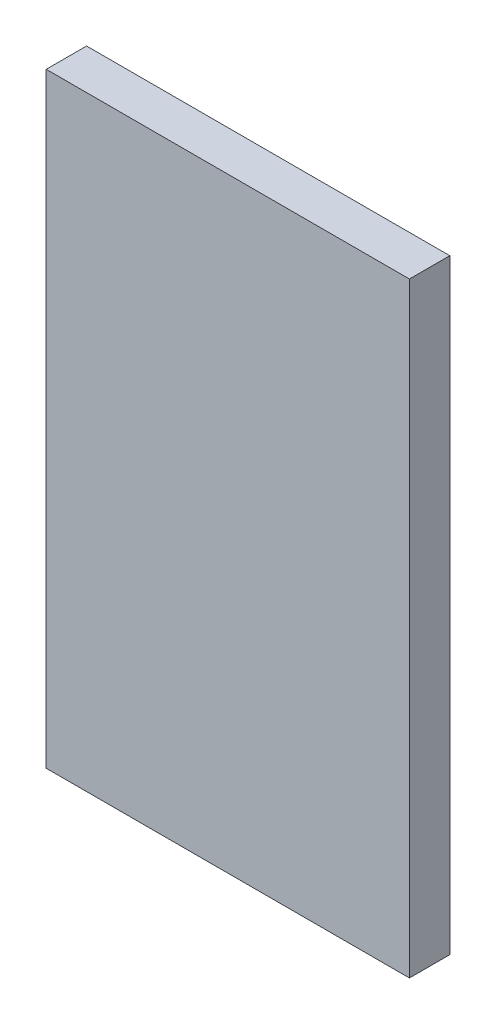
ISO-10303-21;
HEADER;
FILE_DESCRIPTION(('STEP AP214'),'2;1');
FILE_NAME('part.step','',(''),(''),'','','');
FILE_SCHEMA(('AUTOMOTIVE_DESIGN { 1 0 10303 214 1 1 1 1 }'));
ENDSEC;
DATA;
#1=APPLICATION_CONTEXT('core data for automotive mechanical design processes');
#2=APPLICATION_PROTOCOL_DEFINITION('international standard','automotive_design',2000,#1);
#3=PRODUCT_CONTEXT('',#1,'mechanical');
#4=PRODUCT('Part','Part','',(#3));
#5=PRODUCT_RELATED_PRODUCT_CATEGORY('part','',(#4));
#6=PRODUCT_DEFINITION_FORMATION('','',#4);
#7=PRODUCT_DEFINITION_CONTEXT('part definition',#1,'design');
#8=PRODUCT_DEFINITION('design','',#6,#7);
#9=PRODUCT_DEFINITION_SHAPE('','',#8);
#10=(LENGTH_UNIT() NAMED_UNIT(*) SI_UNIT(.MILLI.,.METRE.));
#11=(NAMED_UNIT(*) PLANE_ANGLE_UNIT() SI_UNIT($,.RADIAN.));
#12=(NAMED_UNIT(*) SI_UNIT($,.STERADIAN.) SOLID_ANGLE_UNIT());
#13=UNCERTAINTY_MEASURE_WITH_UNIT(LENGTH_MEASURE(1.E-05),#10,'distance_accuracy_value','');
#14=(GEOMETRIC_REPRESENTATION_CONTEXT(3) GLOBAL_UNCERTAINTY_ASSIGNED_CONTEXT((#13)) GLOBAL_UNIT_ASSIGNED_CONTEXT((#10,
#11,#12)) REPRESENTATION_CONTEXT('',''));
#15=CARTESIAN_POINT('',(0.,0.,0.));
#16=DIRECTION('',(0.,0.,1.));
#17=DIRECTION('',(1.,0.,0.));
#18=AXIS2_PLACEMENT_3D('',#15,#16,#17);
#19=CARTESIAN_POINT('',(0.,0.,2.));
#20=DIRECTION('',(1.,0.,0.));
#21=DIRECTION('',(0.,0.,-1.));
#22=AXIS2_PLACEMENT_3D('',#19,#20,#21);
#23=PLANE('',#22);
#24=DIRECTION('',(0.,-1.,0.));
#25=VECTOR('',#24,1.);
#26=CARTESIAN_POINT('',(0.,0.,0.));
#27=LINE('',#26,#25);
#28=CARTESIAN_POINT('',(0.,30.,0.));
#29=VERTEX_POINT('',#28);
#30=CARTESIAN_POINT('',(0.,0.,0.));
#31=VERTEX_POINT('',#30);
#32=EDGE_CURVE('E96',#29,#31,#27,.T.);
#33=ORIENTED_EDGE('',*,*,#32,.T.);
#34=DIRECTION('',(0.,0.,-1.));
#35=VECTOR('',#34,1.);
#36=CARTESIAN_POINT('',(0.,0.,2.));
#37=LINE('',#36,#35);
#38=CARTESIAN_POINT('',(0.,0.,2.));
#39=VERTEX_POINT('',#38);
#40=EDGE_CURVE('E11',#39,#31,#37,.T.);
#41=ORIENTED_EDGE('',*,*,#40,.F.);
#42=DIRECTION('',(0.,-1.,0.));
#43=VECTOR('',#42,1.);
#44=CARTESIAN_POINT('',(0.,0.,2.));
#45=LINE('',#44,#43);
#46=CARTESIAN_POINT('',(0.,30.,2.));
#47=VERTEX_POINT('',#46);
#48=EDGE_CURVE('E84',#47,#39,#45,.T.);
#49=ORIENTED_EDGE('',*,*,#48,.F.);
#50=DIRECTION('',(0.,0.,-1.));
#51=VECTOR('',#50,1.);
#52=CARTESIAN_POINT('',(0.,30.,2.));
#53=LINE('',#52,#51);
#54=EDGE_CURVE('E92',#47,#29,#53,.T.);
#55=ORIENTED_EDGE('',*,*,#54,.T.);
#56=EDGE_LOOP('',(#33,#41,#49,#55));
#57=FACE_BOUND('',#56,.T.);
#58=ADVANCED_FACE('F33',(#57),#23,.F.);
#59=CARTESIAN_POINT('',(0.,0.,2.));
#60=DIRECTION('',(0.,1.,0.));
#61=DIRECTION('',(0.,0.,1.));
#62=AXIS2_PLACEMENT_3D('',#59,#60,#61);
#63=PLANE('',#62);
#64=DIRECTION('',(1.,0.,0.));
#65=VECTOR('',#64,1.);
#66=CARTESIAN_POINT('',(0.,0.,0.));
#67=LINE('',#66,#65);
#68=CARTESIAN_POINT('',(18.,0.,0.));
#69=VERTEX_POINT('',#68);
#70=EDGE_CURVE('E88',#31,#69,#67,.T.);
#71=ORIENTED_EDGE('',*,*,#70,.T.);
#72=DIRECTION('',(0.,0.,-1.));
#73=VECTOR('',#72,1.);
#74=CARTESIAN_POINT('',(18.,0.,2.));
#75=LINE('',#74,#73);
#76=CARTESIAN_POINT('',(18.,0.,2.));
#77=VERTEX_POINT('',#76);
#78=EDGE_CURVE('E41',#77,#69,#75,.T.);
#79=ORIENTED_EDGE('',*,*,#78,.F.);
#80=DIRECTION('',(1.,0.,0.));
#81=VECTOR('',#80,1.);
#82=CARTESIAN_POINT('',(0.,0.,2.));
#83=LINE('',#82,#81);
#84=EDGE_CURVE('E79',#39,#77,#83,.T.);
#85=ORIENTED_EDGE('',*,*,#84,.F.);
#86=ORIENTED_EDGE('',*,*,#40,.T.);
#87=EDGE_LOOP('',(#71,#79,#85,#86));
#88=FACE_BOUND('',#87,.T.);
#89=ADVANCED_FACE('F87',(#88),#63,.F.);
#90=CARTESIAN_POINT('',(18.,0.,2.));
#91=DIRECTION('',(-1.,0.,0.));
#92=DIRECTION('',(0.,0.,1.));
#93=AXIS2_PLACEMENT_3D('',#90,#91,#92);
#94=PLANE('',#93);
#95=DIRECTION('',(0.,1.,0.));
#96=VECTOR('',#95,1.);
#97=CARTESIAN_POINT('',(18.,0.,0.));
#98=LINE('',#97,#96);
#99=CARTESIAN_POINT('',(18.,30.,0.));
#100=VERTEX_POINT('',#99);
#101=EDGE_CURVE('E66',#69,#100,#98,.T.);
#102=ORIENTED_EDGE('',*,*,#101,.T.);
#103=DIRECTION('',(0.,0.,-1.));
#104=VECTOR('',#103,1.);
#105=CARTESIAN_POINT('',(18.,30.,2.));
#106=LINE('',#105,#104);
#107=CARTESIAN_POINT('',(18.,30.,2.));
#108=VERTEX_POINT('',#107);
#109=EDGE_CURVE('E89',#108,#100,#106,.T.);
#110=ORIENTED_EDGE('',*,*,#109,.F.);
#111=DIRECTION('',(0.,1.,0.));
#112=VECTOR('',#111,1.);
#113=CARTESIAN_POINT('',(18.,0.,2.));
#114=LINE('',#113,#112);
#115=EDGE_CURVE('E82',#77,#108,#114,.T.);
#116=ORIENTED_EDGE('',*,*,#115,.F.);
#117=ORIENTED_EDGE('',*,*,#78,.T.);
#118=EDGE_LOOP('',(#102,#110,#116,#117));
#119=FACE_BOUND('',#118,.T.);
#120=ADVANCED_FACE('F90',(#119),#94,.F.);
#121=CARTESIAN_POINT('',(0.,30.,2.));
#122=DIRECTION('',(0.,-1.,0.));
#123=DIRECTION('',(0.,0.,-1.));
#124=AXIS2_PLACEMENT_3D('',#121,#122,#123);
#125=PLANE('',#124);
#126=DIRECTION('',(-1.,0.,0.));
#127=VECTOR('',#126,1.);
#128=CARTESIAN_POINT('',(0.,30.,0.));
#129=LINE('',#128,#127);
#130=EDGE_CURVE('E72',#100,#29,#129,.T.);
#131=ORIENTED_EDGE('',*,*,#130,.T.);
#132=ORIENTED_EDGE('',*,*,#54,.F.);
#133=DIRECTION('',(-1.,0.,0.));
#134=VECTOR('',#133,1.);
#135=CARTESIAN_POINT('',(0.,30.,2.));
#136=LINE('',#135,#134);
#137=EDGE_CURVE('E49',#108,#47,#136,.T.);
#138=ORIENTED_EDGE('',*,*,#137,.F.);
#139=ORIENTED_EDGE('',*,*,#109,.T.);
#140=EDGE_LOOP('',(#131,#132,#138,#139));
#141=FACE_BOUND('',#140,.T.);
#142=ADVANCED_FACE('F103',(#141),#125,.F.);
#143=CARTESIAN_POINT('',(0.,0.,2.));
#144=DIRECTION('',(0.,0.,-1.));
#145=DIRECTION('',(-1.,0.,0.));
#146=AXIS2_PLACEMENT_3D('',#143,#144,#145);
#147=PLANE('',#146);
#148=ORIENTED_EDGE('',*,*,#48,.T.);
#149=ORIENTED_EDGE('',*,*,#84,.T.);
#150=ORIENTED_EDGE('',*,*,#115,.T.);
#151=ORIENTED_EDGE('',*,*,#137,.T.);
#152=EDGE_LOOP('',(#148,#149,#150,#151));
#153=FACE_BOUND('',#152,.T.);
#154=ADVANCED_FACE('F80',(#153),#147,.F.);
#155=CARTESIAN_POINT('',(0.,0.,0.));
#156=DIRECTION('',(0.,0.,-1.));
#157=DIRECTION('',(-1.,0.,0.));
#158=AXIS2_PLACEMENT_3D('',#155,#156,#157);
#159=PLANE('',#158);
#160=ORIENTED_EDGE('',*,*,#32,.F.);
#161=ORIENTED_EDGE('',*,*,#130,.F.);
#162=ORIENTED_EDGE('',*,*,#101,.F.);
#163=ORIENTED_EDGE('',*,*,#70,.F.);
#164=EDGE_LOOP('',(#160,#161,#162,#163));
#165=FACE_BOUND('',#164,.T.);
#166=ADVANCED_FACE('F106',(#165),#159,.T.);
#167=CLOSED_SHELL('',(#58,#89,#120,#142,#154,#166));
#168=MANIFOLD_SOLID_BREP('B2',#167);
#169=ADVANCED_BREP_SHAPE_REPRESENTATION('',(#18,#168),#14);
#170=SHAPE_DEFINITION_REPRESENTATION(#9,#169);
ENDSEC;
END-ISO-10303-21;
